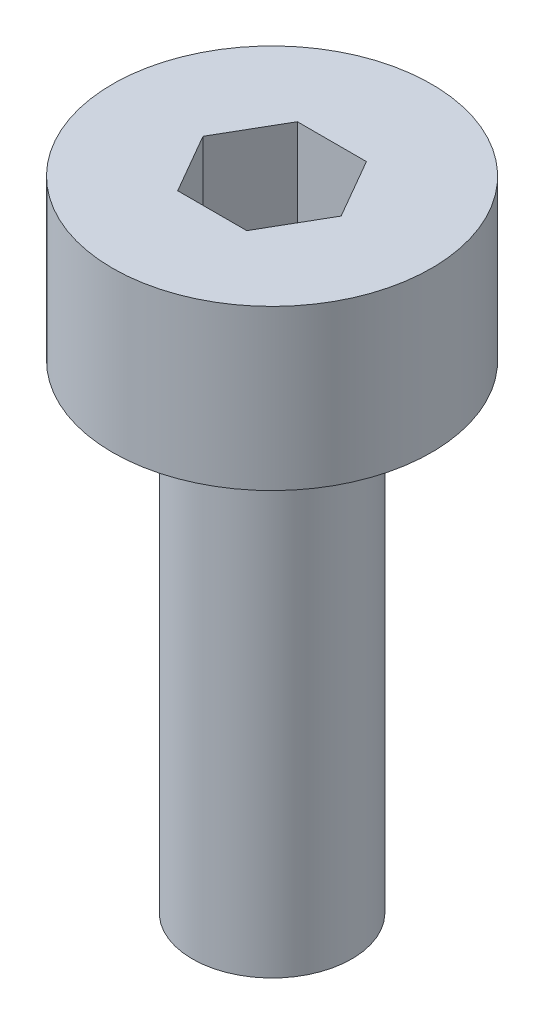
ISO-10303-21;
HEADER;
FILE_DESCRIPTION(('STEP AP214'),'2;1');
FILE_NAME('part.step','',(''),(''),'','','');
FILE_SCHEMA(('AUTOMOTIVE_DESIGN { 1 0 10303 214 1 1 1 1 }'));
ENDSEC;
DATA;
#1=APPLICATION_CONTEXT('core data for automotive mechanical design processes');
#2=APPLICATION_PROTOCOL_DEFINITION('international standard','automotive_design',2000,#1);
#3=PRODUCT_CONTEXT('',#1,'mechanical');
#4=PRODUCT('Part','Part','',(#3));
#5=PRODUCT_RELATED_PRODUCT_CATEGORY('part','',(#4));
#6=PRODUCT_DEFINITION_FORMATION('','',#4);
#7=PRODUCT_DEFINITION_CONTEXT('part definition',#1,'design');
#8=PRODUCT_DEFINITION('design','',#6,#7);
#9=PRODUCT_DEFINITION_SHAPE('','',#8);
#10=(LENGTH_UNIT() NAMED_UNIT(*) SI_UNIT(.MILLI.,.METRE.));
#11=(NAMED_UNIT(*) PLANE_ANGLE_UNIT() SI_UNIT($,.RADIAN.));
#12=(NAMED_UNIT(*) SI_UNIT($,.STERADIAN.) SOLID_ANGLE_UNIT());
#13=UNCERTAINTY_MEASURE_WITH_UNIT(LENGTH_MEASURE(1.E-05),#10,'distance_accuracy_value','');
#14=(GEOMETRIC_REPRESENTATION_CONTEXT(3) GLOBAL_UNCERTAINTY_ASSIGNED_CONTEXT((#13)) GLOBAL_UNIT_ASSIGNED_CONTEXT((#10,
#11,#12)) REPRESENTATION_CONTEXT('',''));
#15=CARTESIAN_POINT('',(0.,0.,0.));
#16=DIRECTION('',(0.,0.,1.));
#17=DIRECTION('',(1.,0.,0.));
#18=AXIS2_PLACEMENT_3D('',#15,#16,#17);
#19=CARTESIAN_POINT('',(0.,12.,0.));
#20=DIRECTION('',(0.,-1.,0.));
#21=DIRECTION('',(0.,0.,-1.));
#22=AXIS2_PLACEMENT_3D('',#19,#20,#21);
#23=CYLINDRICAL_SURFACE('',#22,2.);
#24=CARTESIAN_POINT('',(0.,12.,0.));
#25=DIRECTION('',(0.,1.,0.));
#26=DIRECTION('',(0.,0.,1.));
#27=AXIS2_PLACEMENT_3D('',#24,#25,#26);
#28=CIRCLE('',#27,2.);
#29=CARTESIAN_POINT('',(0.,12.,2.));
#30=VERTEX_POINT('',#29);
#31=EDGE_CURVE('E11',#30,#30,#28,.T.);
#32=ORIENTED_EDGE('',*,*,#31,.F.);
#33=EDGE_LOOP('',(#32));
#34=FACE_BOUND('',#33,.T.);
#35=CARTESIAN_POINT('',(0.,0.,0.));
#36=DIRECTION('',(0.,1.,0.));
#37=DIRECTION('',(0.,0.,1.));
#38=AXIS2_PLACEMENT_3D('',#35,#36,#37);
#39=CIRCLE('',#38,2.);
#40=CARTESIAN_POINT('',(0.,0.,2.));
#41=VERTEX_POINT('',#40);
#42=EDGE_CURVE('E36',#41,#41,#39,.T.);
#43=ORIENTED_EDGE('',*,*,#42,.T.);
#44=EDGE_LOOP('',(#43));
#45=FACE_BOUND('',#44,.T.);
#46=ADVANCED_FACE('F33',(#34,#45),#23,.T.);
#47=CARTESIAN_POINT('',(0.,0.,0.));
#48=DIRECTION('',(0.,1.,0.));
#49=DIRECTION('',(0.,0.,1.));
#50=AXIS2_PLACEMENT_3D('',#47,#48,#49);
#51=PLANE('',#50);
#52=ORIENTED_EDGE('',*,*,#42,.F.);
#53=EDGE_LOOP('',(#52));
#54=FACE_BOUND('',#53,.T.);
#55=ADVANCED_FACE('F164',(#54),#51,.F.);
#56=CARTESIAN_POINT('',(0.,16.,0.));
#57=DIRECTION('',(0.,-1.,0.));
#58=DIRECTION('',(0.,0.,-1.));
#59=AXIS2_PLACEMENT_3D('',#56,#57,#58);
#60=CYLINDRICAL_SURFACE('',#59,4.);
#61=CARTESIAN_POINT('',(0.,16.,0.));
#62=DIRECTION('',(0.,1.,0.));
#63=DIRECTION('',(0.,0.,1.));
#64=AXIS2_PLACEMENT_3D('',#61,#62,#63);
#65=CIRCLE('',#64,4.);
#66=CARTESIAN_POINT('',(0.,16.,4.));
#67=VERTEX_POINT('',#66);
#68=EDGE_CURVE('E140',#67,#67,#65,.T.);
#69=ORIENTED_EDGE('',*,*,#68,.F.);
#70=EDGE_LOOP('',(#69));
#71=FACE_BOUND('',#70,.T.);
#72=CARTESIAN_POINT('',(0.,12.,0.));
#73=DIRECTION('',(0.,1.,0.));
#74=DIRECTION('',(0.,0.,1.));
#75=AXIS2_PLACEMENT_3D('',#72,#73,#74);
#76=CIRCLE('',#75,4.);
#77=CARTESIAN_POINT('',(0.,12.,4.));
#78=VERTEX_POINT('',#77);
#79=EDGE_CURVE('E134',#78,#78,#76,.T.);
#80=ORIENTED_EDGE('',*,*,#79,.T.);
#81=EDGE_LOOP('',(#80));
#82=FACE_BOUND('',#81,.T.);
#83=ADVANCED_FACE('F146',(#71,#82),#60,.T.);
#84=CARTESIAN_POINT('',(0.,16.,0.));
#85=DIRECTION('',(0.,1.,0.));
#86=DIRECTION('',(0.,0.,1.));
#87=AXIS2_PLACEMENT_3D('',#84,#85,#86);
#88=PLANE('',#87);
#89=DIRECTION('',(0.5,0.,-0.866025403784439));
#90=VECTOR('',#89,1.);
#91=CARTESIAN_POINT('',(0.866025403784438,16.,1.5));
#92=LINE('',#91,#90);
#93=CARTESIAN_POINT('',(0.866025403784438,16.,1.5));
#94=VERTEX_POINT('',#93);
#95=CARTESIAN_POINT('',(1.73205080756888,16.,0.));
#96=VERTEX_POINT('',#95);
#97=EDGE_CURVE('E47',#94,#96,#92,.T.);
#98=ORIENTED_EDGE('',*,*,#97,.F.);
#99=DIRECTION('',(1.,0.,0.));
#100=VECTOR('',#99,1.);
#101=CARTESIAN_POINT('',(-0.866025403784439,16.,1.5));
#102=LINE('',#101,#100);
#103=CARTESIAN_POINT('',(-0.866025403784439,16.,1.5));
#104=VERTEX_POINT('',#103);
#105=EDGE_CURVE('E130',#104,#94,#102,.T.);
#106=ORIENTED_EDGE('',*,*,#105,.F.);
#107=DIRECTION('',(0.5,0.,0.866025403784439));
#108=VECTOR('',#107,1.);
#109=CARTESIAN_POINT('',(-1.73205080756888,16.,0.));
#110=LINE('',#109,#108);
#111=CARTESIAN_POINT('',(-1.73205080756888,16.,0.));
#112=VERTEX_POINT('',#111);
#113=EDGE_CURVE('E128',#112,#104,#110,.T.);
#114=ORIENTED_EDGE('',*,*,#113,.F.);
#115=DIRECTION('',(-0.5,0.,0.866025403784439));
#116=VECTOR('',#115,1.);
#117=CARTESIAN_POINT('',(-0.866025403784438,16.,-1.5));
#118=LINE('',#117,#116);
#119=CARTESIAN_POINT('',(-0.866025403784438,16.,-1.5));
#120=VERTEX_POINT('',#119);
#121=EDGE_CURVE('E95',#120,#112,#118,.T.);
#122=ORIENTED_EDGE('',*,*,#121,.F.);
#123=DIRECTION('',(-1.,0.,0.));
#124=VECTOR('',#123,1.);
#125=CARTESIAN_POINT('',(0.866025403784437,16.,-1.5));
#126=LINE('',#125,#124);
#127=CARTESIAN_POINT('',(0.866025403784437,16.,-1.5));
#128=VERTEX_POINT('',#127);
#129=EDGE_CURVE('E124',#128,#120,#126,.T.);
#130=ORIENTED_EDGE('',*,*,#129,.F.);
#131=DIRECTION('',(-0.5,0.,-0.866025403784439));
#132=VECTOR('',#131,1.);
#133=CARTESIAN_POINT('',(1.73205080756888,16.,0.));
#134=LINE('',#133,#132);
#135=EDGE_CURVE('E121',#96,#128,#134,.T.);
#136=ORIENTED_EDGE('',*,*,#135,.F.);
#137=EDGE_LOOP('',(#98,#106,#114,#122,#130,#136));
#138=FACE_BOUND('',#137,.T.);
#139=ORIENTED_EDGE('',*,*,#68,.T.);
#140=EDGE_LOOP('',(#139));
#141=FACE_BOUND('',#140,.T.);
#142=ADVANCED_FACE('F151',(#138,#141),#88,.T.);
#143=CARTESIAN_POINT('',(0.,12.,0.));
#144=DIRECTION('',(0.,1.,0.));
#145=DIRECTION('',(0.,0.,1.));
#146=AXIS2_PLACEMENT_3D('',#143,#144,#145);
#147=PLANE('',#146);
#148=ORIENTED_EDGE('',*,*,#31,.T.);
#149=EDGE_LOOP('',(#148));
#150=FACE_BOUND('',#149,.T.);
#151=ORIENTED_EDGE('',*,*,#79,.F.);
#152=EDGE_LOOP('',(#151));
#153=FACE_BOUND('',#152,.T.);
#154=ADVANCED_FACE('F148',(#150,#153),#147,.F.);
#155=CARTESIAN_POINT('',(0.866025403784438,13.5,1.5));
#156=DIRECTION('',(0.866025403784439,0.,0.5));
#157=DIRECTION('',(0.5,0.,-0.866025403784439));
#158=AXIS2_PLACEMENT_3D('',#155,#156,#157);
#159=PLANE('',#158);
#160=ORIENTED_EDGE('',*,*,#97,.T.);
#161=DIRECTION('',(0.,1.,0.));
#162=VECTOR('',#161,1.);
#163=CARTESIAN_POINT('',(1.73205080756888,13.5,0.));
#164=LINE('',#163,#162);
#165=CARTESIAN_POINT('',(1.73205080756888,13.5,0.));
#166=VERTEX_POINT('',#165);
#167=EDGE_CURVE('E77',#166,#96,#164,.T.);
#168=ORIENTED_EDGE('',*,*,#167,.F.);
#169=DIRECTION('',(0.5,0.,-0.866025403784439));
#170=VECTOR('',#169,1.);
#171=CARTESIAN_POINT('',(0.866025403784438,13.5,1.5));
#172=LINE('',#171,#170);
#173=CARTESIAN_POINT('',(0.866025403784438,13.5,1.5));
#174=VERTEX_POINT('',#173);
#175=EDGE_CURVE('E132',#174,#166,#172,.T.);
#176=ORIENTED_EDGE('',*,*,#175,.F.);
#177=DIRECTION('',(0.,1.,0.));
#178=VECTOR('',#177,1.);
#179=CARTESIAN_POINT('',(0.866025403784438,13.5,1.5));
#180=LINE('',#179,#178);
#181=EDGE_CURVE('E55',#174,#94,#180,.T.);
#182=ORIENTED_EDGE('',*,*,#181,.T.);
#183=EDGE_LOOP('',(#160,#168,#176,#182));
#184=FACE_BOUND('',#183,.T.);
#185=ADVANCED_FACE('F150',(#184),#159,.F.);
#186=CARTESIAN_POINT('',(-0.866025403784439,13.5,1.5));
#187=DIRECTION('',(0.,0.,1.));
#188=DIRECTION('',(1.,0.,0.));
#189=AXIS2_PLACEMENT_3D('',#186,#187,#188);
#190=PLANE('',#189);
#191=ORIENTED_EDGE('',*,*,#105,.T.);
#192=ORIENTED_EDGE('',*,*,#181,.F.);
#193=DIRECTION('',(1.,0.,0.));
#194=VECTOR('',#193,1.);
#195=CARTESIAN_POINT('',(-0.866025403784439,13.5,1.5));
#196=LINE('',#195,#194);
#197=CARTESIAN_POINT('',(-0.866025403784439,13.5,1.5));
#198=VERTEX_POINT('',#197);
#199=EDGE_CURVE('E107',#198,#174,#196,.T.);
#200=ORIENTED_EDGE('',*,*,#199,.F.);
#201=DIRECTION('',(0.,1.,0.));
#202=VECTOR('',#201,1.);
#203=CARTESIAN_POINT('',(-0.866025403784439,13.5,1.5));
#204=LINE('',#203,#202);
#205=EDGE_CURVE('E99',#198,#104,#204,.T.);
#206=ORIENTED_EDGE('',*,*,#205,.T.);
#207=EDGE_LOOP('',(#191,#192,#200,#206));
#208=FACE_BOUND('',#207,.T.);
#209=ADVANCED_FACE('F158',(#208),#190,.F.);
#210=CARTESIAN_POINT('',(-1.73205080756888,13.5,0.));
#211=DIRECTION('',(-0.866025403784439,0.,0.5));
#212=DIRECTION('',(0.5,0.,0.866025403784439));
#213=AXIS2_PLACEMENT_3D('',#210,#211,#212);
#214=PLANE('',#213);
#215=ORIENTED_EDGE('',*,*,#113,.T.);
#216=ORIENTED_EDGE('',*,*,#205,.F.);
#217=DIRECTION('',(0.5,0.,0.866025403784439));
#218=VECTOR('',#217,1.);
#219=CARTESIAN_POINT('',(-1.73205080756888,13.5,0.));
#220=LINE('',#219,#218);
#221=CARTESIAN_POINT('',(-1.73205080756888,13.5,0.));
#222=VERTEX_POINT('',#221);
#223=EDGE_CURVE('E103',#222,#198,#220,.T.);
#224=ORIENTED_EDGE('',*,*,#223,.F.);
#225=DIRECTION('',(0.,1.,0.));
#226=VECTOR('',#225,1.);
#227=CARTESIAN_POINT('',(-1.73205080756888,13.5,0.));
#228=LINE('',#227,#226);
#229=EDGE_CURVE('E88',#222,#112,#228,.T.);
#230=ORIENTED_EDGE('',*,*,#229,.T.);
#231=EDGE_LOOP('',(#215,#216,#224,#230));
#232=FACE_BOUND('',#231,.T.);
#233=ADVANCED_FACE('F104',(#232),#214,.F.);
#234=CARTESIAN_POINT('',(-0.866025403784438,13.5,-1.5));
#235=DIRECTION('',(-0.866025403784438,0.,-0.5));
#236=DIRECTION('',(-0.5,0.,0.866025403784438));
#237=AXIS2_PLACEMENT_3D('',#234,#235,#236);
#238=PLANE('',#237);
#239=ORIENTED_EDGE('',*,*,#121,.T.);
#240=ORIENTED_EDGE('',*,*,#229,.F.);
#241=DIRECTION('',(-0.5,0.,0.866025403784439));
#242=VECTOR('',#241,1.);
#243=CARTESIAN_POINT('',(-0.866025403784438,13.5,-1.5));
#244=LINE('',#243,#242);
#245=CARTESIAN_POINT('',(-0.866025403784438,13.5,-1.5));
#246=VERTEX_POINT('',#245);
#247=EDGE_CURVE('E92',#246,#222,#244,.T.);
#248=ORIENTED_EDGE('',*,*,#247,.F.);
#249=DIRECTION('',(0.,1.,0.));
#250=VECTOR('',#249,1.);
#251=CARTESIAN_POINT('',(-0.866025403784438,13.5,-1.5));
#252=LINE('',#251,#250);
#253=EDGE_CURVE('E100',#246,#120,#252,.T.);
#254=ORIENTED_EDGE('',*,*,#253,.T.);
#255=EDGE_LOOP('',(#239,#240,#248,#254));
#256=FACE_BOUND('',#255,.T.);
#257=ADVANCED_FACE('F90',(#256),#238,.F.);
#258=CARTESIAN_POINT('',(0.866025403784437,13.5,-1.5));
#259=DIRECTION('',(0.,0.,-1.));
#260=DIRECTION('',(-1.,0.,0.));
#261=AXIS2_PLACEMENT_3D('',#258,#259,#260);
#262=PLANE('',#261);
#263=ORIENTED_EDGE('',*,*,#129,.T.);
#264=ORIENTED_EDGE('',*,*,#253,.F.);
#265=DIRECTION('',(-1.,0.,0.));
#266=VECTOR('',#265,1.);
#267=CARTESIAN_POINT('',(0.866025403784437,13.5,-1.5));
#268=LINE('',#267,#266);
#269=CARTESIAN_POINT('',(0.866025403784437,13.5,-1.5));
#270=VERTEX_POINT('',#269);
#271=EDGE_CURVE('E113',#270,#246,#268,.T.);
#272=ORIENTED_EDGE('',*,*,#271,.F.);
#273=DIRECTION('',(0.,1.,0.));
#274=VECTOR('',#273,1.);
#275=CARTESIAN_POINT('',(0.866025403784437,13.5,-1.5));
#276=LINE('',#275,#274);
#277=EDGE_CURVE('E137',#270,#128,#276,.T.);
#278=ORIENTED_EDGE('',*,*,#277,.T.);
#279=EDGE_LOOP('',(#263,#264,#272,#278));
#280=FACE_BOUND('',#279,.T.);
#281=ADVANCED_FACE('F219',(#280),#262,.F.);
#282=CARTESIAN_POINT('',(1.73205080756888,13.5,0.));
#283=DIRECTION('',(0.866025403784439,0.,-0.5));
#284=DIRECTION('',(-0.5,0.,-0.866025403784439));
#285=AXIS2_PLACEMENT_3D('',#282,#283,#284);
#286=PLANE('',#285);
#287=ORIENTED_EDGE('',*,*,#135,.T.);
#288=ORIENTED_EDGE('',*,*,#277,.F.);
#289=DIRECTION('',(-0.5,0.,-0.866025403784439));
#290=VECTOR('',#289,1.);
#291=CARTESIAN_POINT('',(1.73205080756888,13.5,0.));
#292=LINE('',#291,#290);
#293=EDGE_CURVE('E115',#166,#270,#292,.T.);
#294=ORIENTED_EDGE('',*,*,#293,.F.);
#295=ORIENTED_EDGE('',*,*,#167,.T.);
#296=EDGE_LOOP('',(#287,#288,#294,#295));
#297=FACE_BOUND('',#296,.T.);
#298=ADVANCED_FACE('F228',(#297),#286,.F.);
#299=CARTESIAN_POINT('',(0.,13.5,0.));
#300=DIRECTION('',(0.,1.,0.));
#301=DIRECTION('',(0.,0.,1.));
#302=AXIS2_PLACEMENT_3D('',#299,#300,#301);
#303=PLANE('',#302);
#304=ORIENTED_EDGE('',*,*,#175,.T.);
#305=ORIENTED_EDGE('',*,*,#293,.T.);
#306=ORIENTED_EDGE('',*,*,#271,.T.);
#307=ORIENTED_EDGE('',*,*,#247,.T.);
#308=ORIENTED_EDGE('',*,*,#223,.T.);
#309=ORIENTED_EDGE('',*,*,#199,.T.);
#310=EDGE_LOOP('',(#304,#305,#306,#307,#308,#309));
#311=FACE_BOUND('',#310,.T.);
#312=ADVANCED_FACE('F110',(#311),#303,.T.);
#313=CLOSED_SHELL('',(#46,#55,#83,#142,#154,#185,#209,#233,#257,#281,#298,#312));
#314=MANIFOLD_SOLID_BREP('B2',#313);
#315=ADVANCED_BREP_SHAPE_REPRESENTATION('',(#18,#314),#14);
#316=SHAPE_DEFINITION_REPRESENTATION(#9,#315);
ENDSEC;
END-ISO-10303-21;
